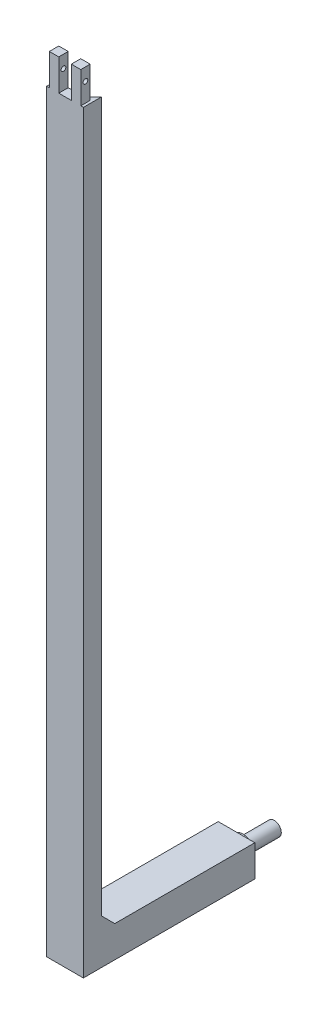
ISO-10303-21;
HEADER;
FILE_DESCRIPTION(('STEP AP214'),'2;1');
FILE_NAME('part.step','',(''),(''),'','','');
FILE_SCHEMA(('AUTOMOTIVE_DESIGN { 1 0 10303 214 1 1 1 1 }'));
ENDSEC;
DATA;
#1=APPLICATION_CONTEXT('core data for automotive mechanical design processes');
#2=APPLICATION_PROTOCOL_DEFINITION('international standard','automotive_design',2000,#1);
#3=PRODUCT_CONTEXT('',#1,'mechanical');
#4=PRODUCT('Part','Part','',(#3));
#5=PRODUCT_RELATED_PRODUCT_CATEGORY('part','',(#4));
#6=PRODUCT_DEFINITION_FORMATION('','',#4);
#7=PRODUCT_DEFINITION_CONTEXT('part definition',#1,'design');
#8=PRODUCT_DEFINITION('design','',#6,#7);
#9=PRODUCT_DEFINITION_SHAPE('','',#8);
#10=(LENGTH_UNIT() NAMED_UNIT(*) SI_UNIT(.MILLI.,.METRE.));
#11=(NAMED_UNIT(*) PLANE_ANGLE_UNIT() SI_UNIT($,.RADIAN.));
#12=(NAMED_UNIT(*) SI_UNIT($,.STERADIAN.) SOLID_ANGLE_UNIT());
#13=UNCERTAINTY_MEASURE_WITH_UNIT(LENGTH_MEASURE(1.E-05),#10,'distance_accuracy_value','');
#14=(GEOMETRIC_REPRESENTATION_CONTEXT(3) GLOBAL_UNCERTAINTY_ASSIGNED_CONTEXT((#13)) GLOBAL_UNIT_ASSIGNED_CONTEXT((#10,
#11,#12)) REPRESENTATION_CONTEXT('',''));
#15=CARTESIAN_POINT('',(0.,0.,0.));
#16=DIRECTION('',(0.,0.,1.));
#17=DIRECTION('',(1.,0.,0.));
#18=AXIS2_PLACEMENT_3D('',#15,#16,#17);
#19=CARTESIAN_POINT('',(0.,0.,0.));
#20=DIRECTION('',(0.,0.,-1.));
#21=DIRECTION('',(-1.,0.,0.));
#22=AXIS2_PLACEMENT_3D('',#19,#20,#21);
#23=PLANE('',#22);
#24=DIRECTION('',(-1.,0.,0.));
#25=VECTOR('',#24,1.);
#26=CARTESIAN_POINT('',(2.82842712474619,-223.,0.));
#27=LINE('',#26,#25);
#28=CARTESIAN_POINT('',(0.,-223.,0.));
#29=VERTEX_POINT('',#28);
#30=CARTESIAN_POINT('',(-5.99999999999997,-223.,0.));
#31=VERTEX_POINT('',#30);
#32=EDGE_CURVE('E64',#29,#31,#27,.T.);
#33=ORIENTED_EDGE('',*,*,#32,.T.);
#34=DIRECTION('',(0.,-1.,0.));
#35=VECTOR('',#34,1.);
#36=CARTESIAN_POINT('',(-6.,0.,0.));
#37=LINE('',#36,#35);
#38=CARTESIAN_POINT('',(-5.99999999999997,0.,0.));
#39=VERTEX_POINT('',#38);
#40=EDGE_CURVE('E339',#39,#31,#37,.T.);
#41=ORIENTED_EDGE('',*,*,#40,.F.);
#42=DIRECTION('',(-1.,0.,0.));
#43=VECTOR('',#42,1.);
#44=CARTESIAN_POINT('',(-7.99999999999998,0.,0.));
#45=LINE('',#44,#43);
#46=CARTESIAN_POINT('',(-7.99999999999998,0.,0.));
#47=VERTEX_POINT('',#46);
#48=EDGE_CURVE('E11',#39,#47,#45,.T.);
#49=ORIENTED_EDGE('',*,*,#48,.T.);
#50=DIRECTION('',(0.,-1.,0.));
#51=VECTOR('',#50,1.);
#52=CARTESIAN_POINT('',(-7.99999999999999,10.,0.));
#53=LINE('',#52,#51);
#54=CARTESIAN_POINT('',(-7.99999999999999,10.,0.));
#55=VERTEX_POINT('',#54);
#56=EDGE_CURVE('E266',#55,#47,#53,.T.);
#57=ORIENTED_EDGE('',*,*,#56,.F.);
#58=DIRECTION('',(-1.,0.,0.));
#59=VECTOR('',#58,1.);
#60=CARTESIAN_POINT('',(-7.99999999999999,10.,0.));
#61=LINE('',#60,#59);
#62=CARTESIAN_POINT('',(-4.99999999999999,10.,0.));
#63=VERTEX_POINT('',#62);
#64=EDGE_CURVE('E263',#63,#55,#61,.T.);
#65=ORIENTED_EDGE('',*,*,#64,.F.);
#66=DIRECTION('',(0.,-1.,0.));
#67=VECTOR('',#66,1.);
#68=CARTESIAN_POINT('',(-4.99999999999999,10.,0.));
#69=LINE('',#68,#67);
#70=CARTESIAN_POINT('',(-4.99999999999998,0.,0.));
#71=VERTEX_POINT('',#70);
#72=EDGE_CURVE('E276',#63,#71,#69,.T.);
#73=ORIENTED_EDGE('',*,*,#72,.T.);
#74=DIRECTION('',(-1.,0.,0.));
#75=VECTOR('',#74,1.);
#76=CARTESIAN_POINT('',(0.,0.,0.));
#77=LINE('',#76,#75);
#78=CARTESIAN_POINT('',(-0.999999999999984,0.,0.));
#79=VERTEX_POINT('',#78);
#80=EDGE_CURVE('E336',#79,#71,#77,.T.);
#81=ORIENTED_EDGE('',*,*,#80,.F.);
#82=DIRECTION('',(0.,-1.,0.));
#83=VECTOR('',#82,1.);
#84=CARTESIAN_POINT('',(-0.999999999999986,10.,0.));
#85=LINE('',#84,#83);
#86=CARTESIAN_POINT('',(-0.999999999999986,10.,0.));
#87=VERTEX_POINT('',#86);
#88=EDGE_CURVE('E243',#87,#79,#85,.T.);
#89=ORIENTED_EDGE('',*,*,#88,.F.);
#90=DIRECTION('',(-1.,0.,0.));
#91=VECTOR('',#90,1.);
#92=CARTESIAN_POINT('',(2.00000000000001,10.,0.));
#93=LINE('',#92,#91);
#94=CARTESIAN_POINT('',(2.00000000000001,10.,0.));
#95=VERTEX_POINT('',#94);
#96=EDGE_CURVE('E215',#95,#87,#93,.T.);
#97=ORIENTED_EDGE('',*,*,#96,.F.);
#98=DIRECTION('',(0.,-1.,0.));
#99=VECTOR('',#98,1.);
#100=CARTESIAN_POINT('',(2.00000000000001,10.,0.));
#101=LINE('',#100,#99);
#102=CARTESIAN_POINT('',(2.00000000000002,0.,0.));
#103=VERTEX_POINT('',#102);
#104=EDGE_CURVE('E247',#95,#103,#101,.T.);
#105=ORIENTED_EDGE('',*,*,#104,.T.);
#106=DIRECTION('',(-1.,0.,0.));
#107=VECTOR('',#106,1.);
#108=CARTESIAN_POINT('',(2.00000000000002,0.,0.));
#109=LINE('',#108,#107);
#110=CARTESIAN_POINT('',(0.,0.,0.));
#111=VERTEX_POINT('',#110);
#112=EDGE_CURVE('E229',#103,#111,#109,.T.);
#113=ORIENTED_EDGE('',*,*,#112,.T.);
#114=DIRECTION('',(0.,1.,0.));
#115=VECTOR('',#114,1.);
#116=CARTESIAN_POINT('',(0.,0.,0.));
#117=LINE('',#116,#115);
#118=EDGE_CURVE('E322',#29,#111,#117,.T.);
#119=ORIENTED_EDGE('',*,*,#118,.F.);
#120=EDGE_LOOP('',(#33,#41,#49,#57,#65,#73,#81,#89,#97,#105,#113,#119));
#121=FACE_BOUND('',#120,.T.);
#122=ADVANCED_FACE('F39',(#121),#23,.T.);
#123=CARTESIAN_POINT('',(0.,0.,0.));
#124=DIRECTION('',(-0.707106781186549,0.,-0.707106781186546));
#125=DIRECTION('',(-0.707106781186546,0.,0.707106781186549));
#126=AXIS2_PLACEMENT_3D('',#123,#124,#125);
#127=PLANE('',#126);
#128=DIRECTION('',(0.577350269189624,-0.577350269189627,-0.577350269189626));
#129=VECTOR('',#128,1.);
#130=CARTESIAN_POINT('',(-74.3333333333333,-148.666666666666,74.3333333333335));
#131=LINE('',#130,#129);
#132=CARTESIAN_POINT('',(2.82842712474619,-225.828427124746,-2.82842712474619));
#133=VERTEX_POINT('',#132);
#134=EDGE_CURVE('E57',#29,#133,#131,.T.);
#135=ORIENTED_EDGE('',*,*,#134,.F.);
#136=ORIENTED_EDGE('',*,*,#118,.T.);
#137=DIRECTION('',(0.707106781186546,0.,-0.707106781186549));
#138=VECTOR('',#137,1.);
#139=CARTESIAN_POINT('',(0.,0.,0.));
#140=LINE('',#139,#138);
#141=CARTESIAN_POINT('',(2.82842712474619,0.,-2.82842712474619));
#142=VERTEX_POINT('',#141);
#143=EDGE_CURVE('E307',#111,#142,#140,.T.);
#144=ORIENTED_EDGE('',*,*,#143,.T.);
#145=DIRECTION('',(0.,-1.,0.));
#146=VECTOR('',#145,1.);
#147=CARTESIAN_POINT('',(2.82842712474619,0.,-2.82842712474619));
#148=LINE('',#147,#146);
#149=EDGE_CURVE('E315',#142,#133,#148,.T.);
#150=ORIENTED_EDGE('',*,*,#149,.T.);
#151=EDGE_LOOP('',(#135,#136,#144,#150));
#152=FACE_BOUND('',#151,.T.);
#153=ADVANCED_FACE('F363',(#152),#127,.T.);
#154=CARTESIAN_POINT('',(-5.99999999999997,0.,0.));
#155=DIRECTION('',(0.707106781186549,0.,-0.707106781186546));
#156=DIRECTION('',(-0.707106781186546,0.,-0.707106781186549));
#157=AXIS2_PLACEMENT_3D('',#154,#155,#156);
#158=PLANE('',#157);
#159=DIRECTION('',(0.577350269189624,0.577350269189627,0.577350269189626));
#160=VECTOR('',#159,1.);
#161=CARTESIAN_POINT('',(68.3333333333333,-148.666666666666,74.3333333333335));
#162=LINE('',#161,#160);
#163=CARTESIAN_POINT('',(-8.82842712474615,-225.828427124746,-2.82842712474619));
#164=VERTEX_POINT('',#163);
#165=EDGE_CURVE('E392',#164,#31,#162,.T.);
#166=ORIENTED_EDGE('',*,*,#165,.F.);
#167=DIRECTION('',(0.,-1.,0.));
#168=VECTOR('',#167,1.);
#169=CARTESIAN_POINT('',(-8.82842712474615,0.,-2.8284271247462));
#170=LINE('',#169,#168);
#171=CARTESIAN_POINT('',(-8.82842712474615,0.,-2.8284271247462));
#172=VERTEX_POINT('',#171);
#173=EDGE_CURVE('E297',#172,#164,#170,.T.);
#174=ORIENTED_EDGE('',*,*,#173,.F.);
#175=DIRECTION('',(0.707106781186546,0.,0.707106781186549));
#176=VECTOR('',#175,1.);
#177=CARTESIAN_POINT('',(-5.99999999999997,0.,0.));
#178=LINE('',#177,#176);
#179=EDGE_CURVE('E293',#172,#39,#178,.T.);
#180=ORIENTED_EDGE('',*,*,#179,.T.);
#181=ORIENTED_EDGE('',*,*,#40,.T.);
#182=EDGE_LOOP('',(#166,#174,#180,#181));
#183=FACE_BOUND('',#182,.T.);
#184=ADVANCED_FACE('F369',(#183),#158,.T.);
#185=CARTESIAN_POINT('',(0.,0.,3.));
#186=DIRECTION('',(0.,-1.,0.));
#187=DIRECTION('',(1.,0.,0.));
#188=AXIS2_PLACEMENT_3D('',#185,#186,#187);
#189=PLANE('',#188);
#190=DIRECTION('',(0.,0.,-1.));
#191=VECTOR('',#190,1.);
#192=CARTESIAN_POINT('',(2.00000000000002,0.,3.));
#193=LINE('',#192,#191);
#194=CARTESIAN_POINT('',(2.00000000000002,0.,3.));
#195=VERTEX_POINT('',#194);
#196=EDGE_CURVE('E210',#195,#103,#193,.T.);
#197=ORIENTED_EDGE('',*,*,#196,.F.);
#198=DIRECTION('',(-1.,0.,0.));
#199=VECTOR('',#198,1.);
#200=CARTESIAN_POINT('',(0.,0.,3.));
#201=LINE('',#200,#199);
#202=CARTESIAN_POINT('',(2.82842712474618,0.,3.));
#203=VERTEX_POINT('',#202);
#204=EDGE_CURVE('E325',#203,#195,#201,.T.);
#205=ORIENTED_EDGE('',*,*,#204,.F.);
#206=DIRECTION('',(0.,0.,1.));
#207=VECTOR('',#206,1.);
#208=CARTESIAN_POINT('',(2.82842712474619,0.,-2.82842712474619));
#209=LINE('',#208,#207);
#210=EDGE_CURVE('E311',#142,#203,#209,.T.);
#211=ORIENTED_EDGE('',*,*,#210,.F.);
#212=ORIENTED_EDGE('',*,*,#143,.F.);
#213=ORIENTED_EDGE('',*,*,#112,.F.);
#214=EDGE_LOOP('',(#197,#205,#211,#212,#213));
#215=FACE_BOUND('',#214,.T.);
#216=ADVANCED_FACE('F386',(#215),#189,.F.);
#217=DIRECTION('',(0.,0.,1.));
#218=VECTOR('',#217,1.);
#219=CARTESIAN_POINT('',(-0.999999999999984,0.,3.));
#220=LINE('',#219,#218);
#221=CARTESIAN_POINT('',(-0.999999999999984,0.,3.));
#222=VERTEX_POINT('',#221);
#223=EDGE_CURVE('E216',#79,#222,#220,.T.);
#224=ORIENTED_EDGE('',*,*,#223,.F.);
#225=ORIENTED_EDGE('',*,*,#80,.T.);
#226=DIRECTION('',(0.,0.,-1.));
#227=VECTOR('',#226,1.);
#228=CARTESIAN_POINT('',(-4.99999999999998,0.,3.));
#229=LINE('',#228,#227);
#230=CARTESIAN_POINT('',(-4.99999999999998,0.,3.));
#231=VERTEX_POINT('',#230);
#232=EDGE_CURVE('E257',#231,#71,#229,.T.);
#233=ORIENTED_EDGE('',*,*,#232,.F.);
#234=EDGE_CURVE('E329',#222,#231,#201,.T.);
#235=ORIENTED_EDGE('',*,*,#234,.F.);
#236=EDGE_LOOP('',(#224,#225,#233,#235));
#237=FACE_BOUND('',#236,.T.);
#238=ADVANCED_FACE('F384',(#237),#189,.F.);
#239=DIRECTION('',(0.,0.,1.));
#240=VECTOR('',#239,1.);
#241=CARTESIAN_POINT('',(-7.99999999999999,0.,3.));
#242=LINE('',#241,#240);
#243=CARTESIAN_POINT('',(-7.99999999999999,0.,3.));
#244=VERTEX_POINT('',#243);
#245=EDGE_CURVE('E251',#47,#244,#242,.T.);
#246=ORIENTED_EDGE('',*,*,#245,.F.);
#247=ORIENTED_EDGE('',*,*,#48,.F.);
#248=ORIENTED_EDGE('',*,*,#179,.F.);
#249=DIRECTION('',(0.,0.,-1.));
#250=VECTOR('',#249,1.);
#251=CARTESIAN_POINT('',(-8.82842712474615,0.,-2.8284271247462));
#252=LINE('',#251,#250);
#253=CARTESIAN_POINT('',(-8.82842712474615,0.,3.));
#254=VERTEX_POINT('',#253);
#255=EDGE_CURVE('E289',#254,#172,#252,.T.);
#256=ORIENTED_EDGE('',*,*,#255,.F.);
#257=EDGE_CURVE('E330',#244,#254,#201,.T.);
#258=ORIENTED_EDGE('',*,*,#257,.F.);
#259=EDGE_LOOP('',(#246,#247,#248,#256,#258));
#260=FACE_BOUND('',#259,.T.);
#261=ADVANCED_FACE('F41',(#260),#189,.F.);
#262=CARTESIAN_POINT('',(0.,-240.,3.));
#263=DIRECTION('',(0.,1.,0.));
#264=DIRECTION('',(0.,0.,1.));
#265=AXIS2_PLACEMENT_3D('',#262,#263,#264);
#266=PLANE('',#265);
#267=DIRECTION('',(0.,0.,-1.));
#268=VECTOR('',#267,1.);
#269=CARTESIAN_POINT('',(-8.82842712474615,-240.,-2.8284271247462));
#270=LINE('',#269,#268);
#271=CARTESIAN_POINT('',(-8.82842712474615,-240.,3.));
#272=VERTEX_POINT('',#271);
#273=CARTESIAN_POINT('',(-8.82842712474615,-240.,-51.58));
#274=VERTEX_POINT('',#273);
#275=EDGE_CURVE('E288',#272,#274,#270,.T.);
#276=ORIENTED_EDGE('',*,*,#275,.T.);
#277=DIRECTION('',(-1.,0.,0.));
#278=VECTOR('',#277,1.);
#279=CARTESIAN_POINT('',(-8.82842712474615,-240.,-51.58));
#280=LINE('',#279,#278);
#281=CARTESIAN_POINT('',(2.82842712474619,-240.,-51.58));
#282=VERTEX_POINT('',#281);
#283=EDGE_CURVE('E180',#282,#274,#280,.T.);
#284=ORIENTED_EDGE('',*,*,#283,.F.);
#285=DIRECTION('',(0.,0.,1.));
#286=VECTOR('',#285,1.);
#287=CARTESIAN_POINT('',(2.82842712474619,-240.,-2.82842712474619));
#288=LINE('',#287,#286);
#289=CARTESIAN_POINT('',(2.82842712474618,-240.,3.));
#290=VERTEX_POINT('',#289);
#291=EDGE_CURVE('E304',#282,#290,#288,.T.);
#292=ORIENTED_EDGE('',*,*,#291,.T.);
#293=DIRECTION('',(1.,0.,0.));
#294=VECTOR('',#293,1.);
#295=CARTESIAN_POINT('',(0.,-240.,3.));
#296=LINE('',#295,#294);
#297=EDGE_CURVE('E49',#272,#290,#296,.T.);
#298=ORIENTED_EDGE('',*,*,#297,.F.);
#299=EDGE_LOOP('',(#276,#284,#292,#298));
#300=FACE_BOUND('',#299,.T.);
#301=ADVANCED_FACE('F373',(#300),#266,.F.);
#302=CARTESIAN_POINT('',(0.,0.,3.));
#303=DIRECTION('',(0.,0.,-1.));
#304=DIRECTION('',(-1.,0.,0.));
#305=AXIS2_PLACEMENT_3D('',#302,#303,#304);
#306=PLANE('',#305);
#307=ORIENTED_EDGE('',*,*,#297,.T.);
#308=DIRECTION('',(0.,-1.,0.));
#309=VECTOR('',#308,1.);
#310=CARTESIAN_POINT('',(2.82842712474618,0.,3.));
#311=LINE('',#310,#309);
#312=EDGE_CURVE('E318',#203,#290,#311,.T.);
#313=ORIENTED_EDGE('',*,*,#312,.F.);
#314=ORIENTED_EDGE('',*,*,#204,.T.);
#315=DIRECTION('',(0.,-1.,0.));
#316=VECTOR('',#315,1.);
#317=CARTESIAN_POINT('',(2.00000000000002,10.,3.));
#318=LINE('',#317,#316);
#319=CARTESIAN_POINT('',(2.00000000000002,10.,3.));
#320=VERTEX_POINT('',#319);
#321=EDGE_CURVE('E225',#320,#195,#318,.T.);
#322=ORIENTED_EDGE('',*,*,#321,.F.);
#323=DIRECTION('',(1.,0.,0.));
#324=VECTOR('',#323,1.);
#325=CARTESIAN_POINT('',(2.00000000000002,10.,3.));
#326=LINE('',#325,#324);
#327=CARTESIAN_POINT('',(-0.999999999999986,10.,3.));
#328=VERTEX_POINT('',#327);
#329=EDGE_CURVE('E222',#328,#320,#326,.T.);
#330=ORIENTED_EDGE('',*,*,#329,.F.);
#331=DIRECTION('',(0.,-1.,0.));
#332=VECTOR('',#331,1.);
#333=CARTESIAN_POINT('',(-0.999999999999986,10.,3.));
#334=LINE('',#333,#332);
#335=EDGE_CURVE('E239',#328,#222,#334,.T.);
#336=ORIENTED_EDGE('',*,*,#335,.T.);
#337=ORIENTED_EDGE('',*,*,#234,.T.);
#338=DIRECTION('',(0.,-1.,0.));
#339=VECTOR('',#338,1.);
#340=CARTESIAN_POINT('',(-4.99999999999999,10.,3.));
#341=LINE('',#340,#339);
#342=CARTESIAN_POINT('',(-4.99999999999999,10.,3.));
#343=VERTEX_POINT('',#342);
#344=EDGE_CURVE('E280',#343,#231,#341,.T.);
#345=ORIENTED_EDGE('',*,*,#344,.F.);
#346=DIRECTION('',(1.,0.,0.));
#347=VECTOR('',#346,1.);
#348=CARTESIAN_POINT('',(-7.99999999999999,10.,3.));
#349=LINE('',#348,#347);
#350=CARTESIAN_POINT('',(-7.99999999999999,10.,3.));
#351=VERTEX_POINT('',#350);
#352=EDGE_CURVE('E256',#351,#343,#349,.T.);
#353=ORIENTED_EDGE('',*,*,#352,.F.);
#354=DIRECTION('',(0.,-1.,0.));
#355=VECTOR('',#354,1.);
#356=CARTESIAN_POINT('',(-7.99999999999999,10.,3.));
#357=LINE('',#356,#355);
#358=EDGE_CURVE('E284',#351,#244,#357,.T.);
#359=ORIENTED_EDGE('',*,*,#358,.T.);
#360=ORIENTED_EDGE('',*,*,#257,.T.);
#361=DIRECTION('',(0.,-1.,0.));
#362=VECTOR('',#361,1.);
#363=CARTESIAN_POINT('',(-8.82842712474615,0.,3.));
#364=LINE('',#363,#362);
#365=EDGE_CURVE('E300',#254,#272,#364,.T.);
#366=ORIENTED_EDGE('',*,*,#365,.T.);
#367=EDGE_LOOP('',(#307,#313,#314,#322,#330,#336,#337,#345,#353,#359,#360,#366));
#368=FACE_BOUND('',#367,.T.);
#369=ADVANCED_FACE('F372',(#368),#306,.F.);
#370=CARTESIAN_POINT('',(2.82842712474619,0.,-2.82842712474619));
#371=DIRECTION('',(1.,0.,0.));
#372=DIRECTION('',(0.,0.,-1.));
#373=AXIS2_PLACEMENT_3D('',#370,#371,#372);
#374=PLANE('',#373);
#375=DIRECTION('',(0.,-0.707106781186548,-0.707106781186547));
#376=VECTOR('',#375,1.);
#377=CARTESIAN_POINT('',(2.82842712474619,-223.,0.));
#378=LINE('',#377,#376);
#379=CARTESIAN_POINT('',(2.82842712474619,-230.,-7.));
#380=VERTEX_POINT('',#379);
#381=EDGE_CURVE('E398',#133,#380,#378,.T.);
#382=ORIENTED_EDGE('',*,*,#381,.F.);
#383=ORIENTED_EDGE('',*,*,#149,.F.);
#384=ORIENTED_EDGE('',*,*,#210,.T.);
#385=ORIENTED_EDGE('',*,*,#312,.T.);
#386=ORIENTED_EDGE('',*,*,#291,.F.);
#387=DIRECTION('',(0.,-1.,0.));
#388=VECTOR('',#387,1.);
#389=CARTESIAN_POINT('',(2.82842712474619,-240.,-51.58));
#390=LINE('',#389,#388);
#391=CARTESIAN_POINT('',(2.82842712474619,-230.,-51.58));
#392=VERTEX_POINT('',#391);
#393=EDGE_CURVE('E173',#392,#282,#390,.T.);
#394=ORIENTED_EDGE('',*,*,#393,.F.);
#395=DIRECTION('',(0.,0.,1.));
#396=VECTOR('',#395,1.);
#397=CARTESIAN_POINT('',(2.82842712474619,-230.,-51.58));
#398=LINE('',#397,#396);
#399=EDGE_CURVE('E168',#392,#380,#398,.T.);
#400=ORIENTED_EDGE('',*,*,#399,.T.);
#401=EDGE_LOOP('',(#382,#383,#384,#385,#386,#394,#400));
#402=FACE_BOUND('',#401,.T.);
#403=ADVANCED_FACE('F381',(#402),#374,.T.);
#404=CARTESIAN_POINT('',(-8.82842712474615,0.,-2.8284271247462));
#405=DIRECTION('',(-1.,0.,0.));
#406=DIRECTION('',(0.,0.,1.));
#407=AXIS2_PLACEMENT_3D('',#404,#405,#406);
#408=PLANE('',#407);
#409=ORIENTED_EDGE('',*,*,#173,.T.);
#410=DIRECTION('',(0.,-0.707106781186548,-0.707106781186547));
#411=VECTOR('',#410,1.);
#412=CARTESIAN_POINT('',(-8.82842712474615,-223.,0.));
#413=LINE('',#412,#411);
#414=CARTESIAN_POINT('',(-8.82842712474615,-230.,-7.));
#415=VERTEX_POINT('',#414);
#416=EDGE_CURVE('E189',#164,#415,#413,.T.);
#417=ORIENTED_EDGE('',*,*,#416,.T.);
#418=DIRECTION('',(0.,0.,1.));
#419=VECTOR('',#418,1.);
#420=CARTESIAN_POINT('',(-8.82842712474615,-230.,-51.58));
#421=LINE('',#420,#419);
#422=CARTESIAN_POINT('',(-8.82842712474615,-230.,-51.58));
#423=VERTEX_POINT('',#422);
#424=EDGE_CURVE('E165',#423,#415,#421,.T.);
#425=ORIENTED_EDGE('',*,*,#424,.F.);
#426=DIRECTION('',(0.,1.,0.));
#427=VECTOR('',#426,1.);
#428=CARTESIAN_POINT('',(-8.82842712474615,-240.,-51.58));
#429=LINE('',#428,#427);
#430=EDGE_CURVE('E174',#274,#423,#429,.T.);
#431=ORIENTED_EDGE('',*,*,#430,.F.);
#432=ORIENTED_EDGE('',*,*,#275,.F.);
#433=ORIENTED_EDGE('',*,*,#365,.F.);
#434=ORIENTED_EDGE('',*,*,#255,.T.);
#435=EDGE_LOOP('',(#409,#417,#425,#431,#432,#433,#434));
#436=FACE_BOUND('',#435,.T.);
#437=ADVANCED_FACE('F187',(#436),#408,.T.);
#438=CARTESIAN_POINT('',(-7.99999999999999,10.,3.));
#439=DIRECTION('',(1.,0.,0.));
#440=DIRECTION('',(0.,0.,-1.));
#441=AXIS2_PLACEMENT_3D('',#438,#439,#440);
#442=PLANE('',#441);
#443=CARTESIAN_POINT('',(-7.99999999999999,6.,1.50000000000001));
#444=DIRECTION('',(1.,0.,0.));
#445=DIRECTION('',(0.,0.,-1.));
#446=AXIS2_PLACEMENT_3D('',#443,#444,#445);
#447=CIRCLE('',#446,0.75);
#448=CARTESIAN_POINT('',(-7.99999999999999,6.,0.750000000000006));
#449=VERTEX_POINT('',#448);
#450=EDGE_CURVE('E206',#449,#449,#447,.T.);
#451=ORIENTED_EDGE('',*,*,#450,.T.);
#452=EDGE_LOOP('',(#451));
#453=FACE_BOUND('',#452,.T.);
#454=ORIENTED_EDGE('',*,*,#245,.T.);
#455=ORIENTED_EDGE('',*,*,#358,.F.);
#456=DIRECTION('',(0.,0.,1.));
#457=VECTOR('',#456,1.);
#458=CARTESIAN_POINT('',(-7.99999999999999,10.,3.));
#459=LINE('',#458,#457);
#460=EDGE_CURVE('E252',#55,#351,#459,.T.);
#461=ORIENTED_EDGE('',*,*,#460,.F.);
#462=ORIENTED_EDGE('',*,*,#56,.T.);
#463=EDGE_LOOP('',(#454,#455,#461,#462));
#464=FACE_BOUND('',#463,.T.);
#465=ADVANCED_FACE('F444',(#453,#464),#442,.F.);
#466=CARTESIAN_POINT('',(-4.99999999999999,10.,3.));
#467=DIRECTION('',(-1.,0.,0.));
#468=DIRECTION('',(0.,-1.,0.));
#469=AXIS2_PLACEMENT_3D('',#466,#467,#468);
#470=PLANE('',#469);
#471=CARTESIAN_POINT('',(-4.99999999999998,6.,1.5));
#472=DIRECTION('',(-1.,0.,0.));
#473=DIRECTION('',(0.,-1.,0.));
#474=AXIS2_PLACEMENT_3D('',#471,#472,#473);
#475=CIRCLE('',#474,0.75);
#476=CARTESIAN_POINT('',(-4.99999999999998,5.25,1.5));
#477=VERTEX_POINT('',#476);
#478=EDGE_CURVE('E202',#477,#477,#475,.T.);
#479=ORIENTED_EDGE('',*,*,#478,.T.);
#480=EDGE_LOOP('',(#479));
#481=FACE_BOUND('',#480,.T.);
#482=ORIENTED_EDGE('',*,*,#232,.T.);
#483=ORIENTED_EDGE('',*,*,#72,.F.);
#484=DIRECTION('',(0.,0.,-1.));
#485=VECTOR('',#484,1.);
#486=CARTESIAN_POINT('',(-4.99999999999999,10.,3.));
#487=LINE('',#486,#485);
#488=EDGE_CURVE('E260',#343,#63,#487,.T.);
#489=ORIENTED_EDGE('',*,*,#488,.F.);
#490=ORIENTED_EDGE('',*,*,#344,.T.);
#491=EDGE_LOOP('',(#482,#483,#489,#490));
#492=FACE_BOUND('',#491,.T.);
#493=ADVANCED_FACE('F452',(#481,#492),#470,.F.);
#494=CARTESIAN_POINT('',(0.,10.,0.));
#495=DIRECTION('',(0.,-1.,0.));
#496=DIRECTION('',(1.,0.,0.));
#497=AXIS2_PLACEMENT_3D('',#494,#495,#496);
#498=PLANE('',#497);
#499=ORIENTED_EDGE('',*,*,#460,.T.);
#500=ORIENTED_EDGE('',*,*,#352,.T.);
#501=ORIENTED_EDGE('',*,*,#488,.T.);
#502=ORIENTED_EDGE('',*,*,#64,.T.);
#503=EDGE_LOOP('',(#499,#500,#501,#502));
#504=FACE_BOUND('',#503,.T.);
#505=ADVANCED_FACE('F448',(#504),#498,.F.);
#506=CARTESIAN_POINT('',(2.00000000000002,10.,3.));
#507=DIRECTION('',(-1.,0.,0.));
#508=DIRECTION('',(0.,0.,1.));
#509=AXIS2_PLACEMENT_3D('',#506,#507,#508);
#510=PLANE('',#509);
#511=CARTESIAN_POINT('',(2.00000000000002,6.,1.5));
#512=DIRECTION('',(1.,0.,0.));
#513=DIRECTION('',(0.,0.,-1.));
#514=AXIS2_PLACEMENT_3D('',#511,#512,#513);
#515=CIRCLE('',#514,0.75);
#516=CARTESIAN_POINT('',(2.00000000000002,6.,0.75));
#517=VERTEX_POINT('',#516);
#518=EDGE_CURVE('E192',#517,#517,#515,.T.);
#519=ORIENTED_EDGE('',*,*,#518,.F.);
#520=EDGE_LOOP('',(#519));
#521=FACE_BOUND('',#520,.T.);
#522=ORIENTED_EDGE('',*,*,#196,.T.);
#523=ORIENTED_EDGE('',*,*,#104,.F.);
#524=DIRECTION('',(0.,0.,-1.));
#525=VECTOR('',#524,1.);
#526=CARTESIAN_POINT('',(2.00000000000002,10.,3.));
#527=LINE('',#526,#525);
#528=EDGE_CURVE('E211',#320,#95,#527,.T.);
#529=ORIENTED_EDGE('',*,*,#528,.F.);
#530=ORIENTED_EDGE('',*,*,#321,.T.);
#531=EDGE_LOOP('',(#522,#523,#529,#530));
#532=FACE_BOUND('',#531,.T.);
#533=ADVANCED_FACE('F429',(#521,#532),#510,.F.);
#534=CARTESIAN_POINT('',(-0.999999999999986,10.,3.));
#535=DIRECTION('',(1.,0.,0.));
#536=DIRECTION('',(0.,1.,0.));
#537=AXIS2_PLACEMENT_3D('',#534,#535,#536);
#538=PLANE('',#537);
#539=CARTESIAN_POINT('',(-0.999999999999987,6.,1.5));
#540=DIRECTION('',(1.,0.,0.));
#541=DIRECTION('',(0.,1.,0.));
#542=AXIS2_PLACEMENT_3D('',#539,#540,#541);
#543=CIRCLE('',#542,0.75);
#544=CARTESIAN_POINT('',(-0.999999999999987,6.75,1.5));
#545=VERTEX_POINT('',#544);
#546=EDGE_CURVE('E197',#545,#545,#543,.T.);
#547=ORIENTED_EDGE('',*,*,#546,.T.);
#548=EDGE_LOOP('',(#547));
#549=FACE_BOUND('',#548,.T.);
#550=ORIENTED_EDGE('',*,*,#223,.T.);
#551=ORIENTED_EDGE('',*,*,#335,.F.);
#552=DIRECTION('',(0.,0.,1.));
#553=VECTOR('',#552,1.);
#554=CARTESIAN_POINT('',(-0.999999999999986,10.,3.));
#555=LINE('',#554,#553);
#556=EDGE_CURVE('E219',#87,#328,#555,.T.);
#557=ORIENTED_EDGE('',*,*,#556,.F.);
#558=ORIENTED_EDGE('',*,*,#88,.T.);
#559=EDGE_LOOP('',(#550,#551,#557,#558));
#560=FACE_BOUND('',#559,.T.);
#561=ADVANCED_FACE('F345',(#549,#560),#538,.F.);
#562=CARTESIAN_POINT('',(0.,10.,0.));
#563=DIRECTION('',(0.,1.,0.));
#564=DIRECTION('',(-1.,0.,0.));
#565=AXIS2_PLACEMENT_3D('',#562,#563,#564);
#566=PLANE('',#565);
#567=ORIENTED_EDGE('',*,*,#528,.T.);
#568=ORIENTED_EDGE('',*,*,#96,.T.);
#569=ORIENTED_EDGE('',*,*,#556,.T.);
#570=ORIENTED_EDGE('',*,*,#329,.T.);
#571=EDGE_LOOP('',(#567,#568,#569,#570));
#572=FACE_BOUND('',#571,.T.);
#573=ADVANCED_FACE('F351',(#572),#566,.T.);
#574=CARTESIAN_POINT('',(-38.,5.99999999999999,1.50000000000002));
#575=DIRECTION('',(1.,0.,0.));
#576=DIRECTION('',(0.,0.,-1.));
#577=AXIS2_PLACEMENT_3D('',#574,#575,#576);
#578=CYLINDRICAL_SURFACE('',#577,0.75);
#579=ORIENTED_EDGE('',*,*,#518,.T.);
#580=EDGE_LOOP('',(#579));
#581=FACE_BOUND('',#580,.T.);
#582=ORIENTED_EDGE('',*,*,#546,.F.);
#583=EDGE_LOOP('',(#582));
#584=FACE_BOUND('',#583,.T.);
#585=ADVANCED_FACE('F348',(#581,#584),#578,.F.);
#586=ORIENTED_EDGE('',*,*,#478,.F.);
#587=EDGE_LOOP('',(#586));
#588=FACE_BOUND('',#587,.T.);
#589=ORIENTED_EDGE('',*,*,#450,.F.);
#590=EDGE_LOOP('',(#589));
#591=FACE_BOUND('',#590,.T.);
#592=ADVANCED_FACE('F350',(#588,#591),#578,.F.);
#593=CARTESIAN_POINT('',(-8.82842712474615,-230.,-51.58));
#594=DIRECTION('',(0.,-1.,0.));
#595=DIRECTION('',(0.,0.,-1.));
#596=AXIS2_PLACEMENT_3D('',#593,#594,#595);
#597=PLANE('',#596);
#598=ORIENTED_EDGE('',*,*,#424,.T.);
#599=DIRECTION('',(-1.,0.,0.));
#600=VECTOR('',#599,1.);
#601=CARTESIAN_POINT('',(2.82842712474619,-230.,-7.));
#602=LINE('',#601,#600);
#603=EDGE_CURVE('E396',#380,#415,#602,.T.);
#604=ORIENTED_EDGE('',*,*,#603,.F.);
#605=ORIENTED_EDGE('',*,*,#399,.F.);
#606=DIRECTION('',(1.,0.,0.));
#607=VECTOR('',#606,1.);
#608=CARTESIAN_POINT('',(-8.82842712474615,-230.,-51.58));
#609=LINE('',#608,#607);
#610=EDGE_CURVE('E161',#423,#392,#609,.T.);
#611=ORIENTED_EDGE('',*,*,#610,.F.);
#612=EDGE_LOOP('',(#598,#604,#605,#611));
#613=FACE_BOUND('',#612,.T.);
#614=ADVANCED_FACE('F163',(#613),#597,.F.);
#615=CARTESIAN_POINT('',(0.,0.,-51.58));
#616=DIRECTION('',(0.,0.,-1.));
#617=DIRECTION('',(-1.,0.,0.));
#618=AXIS2_PLACEMENT_3D('',#615,#616,#617);
#619=PLANE('',#618);
#620=CARTESIAN_POINT('',(-2.99999999999999,-235.,-51.58));
#621=DIRECTION('',(0.,0.,-1.));
#622=DIRECTION('',(-1.,0.,0.));
#623=AXIS2_PLACEMENT_3D('',#620,#621,#622);
#624=CIRCLE('',#623,3.5);
#625=CARTESIAN_POINT('',(-6.49999999999999,-235.,-51.58));
#626=VERTEX_POINT('',#625);
#627=EDGE_CURVE('E702',#626,#626,#624,.T.);
#628=ORIENTED_EDGE('',*,*,#627,.F.);
#629=EDGE_LOOP('',(#628));
#630=FACE_BOUND('',#629,.T.);
#631=ORIENTED_EDGE('',*,*,#430,.T.);
#632=ORIENTED_EDGE('',*,*,#610,.T.);
#633=ORIENTED_EDGE('',*,*,#393,.T.);
#634=ORIENTED_EDGE('',*,*,#283,.T.);
#635=EDGE_LOOP('',(#631,#632,#633,#634));
#636=FACE_BOUND('',#635,.T.);
#637=ADVANCED_FACE('F178',(#630,#636),#619,.T.);
#638=CARTESIAN_POINT('',(2.82842712474619,-223.,0.));
#639=DIRECTION('',(0.,0.707106781186547,-0.707106781186548));
#640=DIRECTION('',(0.,0.707106781186548,0.707106781186547));
#641=AXIS2_PLACEMENT_3D('',#638,#639,#640);
#642=PLANE('',#641);
#643=ORIENTED_EDGE('',*,*,#32,.F.);
#644=ORIENTED_EDGE('',*,*,#134,.T.);
#645=ORIENTED_EDGE('',*,*,#381,.T.);
#646=ORIENTED_EDGE('',*,*,#603,.T.);
#647=ORIENTED_EDGE('',*,*,#416,.F.);
#648=ORIENTED_EDGE('',*,*,#165,.T.);
#649=EDGE_LOOP('',(#643,#644,#645,#646,#647,#648));
#650=FACE_BOUND('',#649,.T.);
#651=ADVANCED_FACE('F394',(#650),#642,.T.);
#652=CARTESIAN_POINT('',(-2.99999999999999,-235.,-53.58));
#653=DIRECTION('',(0.,0.,1.));
#654=DIRECTION('',(1.,0.,0.));
#655=AXIS2_PLACEMENT_3D('',#652,#653,#654);
#656=CYLINDRICAL_SURFACE('',#655,3.5);
#657=CARTESIAN_POINT('',(-2.99999999999999,-235.,-53.58));
#658=DIRECTION('',(0.,0.,-1.));
#659=DIRECTION('',(-1.,0.,0.));
#660=AXIS2_PLACEMENT_3D('',#657,#658,#659);
#661=CIRCLE('',#660,3.5);
#662=CARTESIAN_POINT('',(-6.49999999999999,-235.,-53.58));
#663=VERTEX_POINT('',#662);
#664=EDGE_CURVE('E404',#663,#663,#661,.T.);
#665=ORIENTED_EDGE('',*,*,#664,.F.);
#666=EDGE_LOOP('',(#665));
#667=FACE_BOUND('',#666,.T.);
#668=ORIENTED_EDGE('',*,*,#627,.T.);
#669=EDGE_LOOP('',(#668));
#670=FACE_BOUND('',#669,.T.);
#671=ADVANCED_FACE('F494',(#667,#670),#656,.T.);
#672=CARTESIAN_POINT('',(-2.99999999999999,-235.,-53.58));
#673=DIRECTION('',(0.,0.,-1.));
#674=DIRECTION('',(-1.,0.,0.));
#675=AXIS2_PLACEMENT_3D('',#672,#673,#674);
#676=PLANE('',#675);
#677=CARTESIAN_POINT('',(-2.99999999999999,-235.,-53.58));
#678=DIRECTION('',(0.,0.,-1.));
#679=DIRECTION('',(-1.,0.,0.));
#680=AXIS2_PLACEMENT_3D('',#677,#678,#679);
#681=CIRCLE('',#680,2.25);
#682=CARTESIAN_POINT('',(-5.24999999999999,-235.,-53.58));
#683=VERTEX_POINT('',#682);
#684=EDGE_CURVE('E43',#683,#683,#681,.T.);
#685=ORIENTED_EDGE('',*,*,#684,.F.);
#686=EDGE_LOOP('',(#685));
#687=FACE_BOUND('',#686,.T.);
#688=ORIENTED_EDGE('',*,*,#664,.T.);
#689=EDGE_LOOP('',(#688));
#690=FACE_BOUND('',#689,.T.);
#691=ADVANCED_FACE('F500',(#687,#690),#676,.T.);
#692=CARTESIAN_POINT('',(-2.99999999999999,-235.,-63.58));
#693=DIRECTION('',(0.,0.,-1.));
#694=DIRECTION('',(-1.,0.,0.));
#695=AXIS2_PLACEMENT_3D('',#692,#693,#694);
#696=PLANE('',#695);
#697=CARTESIAN_POINT('',(-2.99999999999999,-235.,-63.58));
#698=DIRECTION('',(0.,0.,-1.));
#699=DIRECTION('',(-1.,0.,0.));
#700=AXIS2_PLACEMENT_3D('',#697,#698,#699);
#701=CIRCLE('',#700,2.25);
#702=CARTESIAN_POINT('',(-5.24999999999999,-235.,-63.58));
#703=VERTEX_POINT('',#702);
#704=EDGE_CURVE('E184',#703,#703,#701,.T.);
#705=ORIENTED_EDGE('',*,*,#704,.T.);
#706=EDGE_LOOP('',(#705));
#707=FACE_BOUND('',#706,.T.);
#708=ADVANCED_FACE('F508',(#707),#696,.T.);
#709=CARTESIAN_POINT('',(-2.99999999999999,-235.,-63.58));
#710=DIRECTION('',(0.,0.,1.));
#711=DIRECTION('',(1.,0.,0.));
#712=AXIS2_PLACEMENT_3D('',#709,#710,#711);
#713=CYLINDRICAL_SURFACE('',#712,2.25);
#714=ORIENTED_EDGE('',*,*,#684,.T.);
#715=EDGE_LOOP('',(#714));
#716=FACE_BOUND('',#715,.T.);
#717=ORIENTED_EDGE('',*,*,#704,.F.);
#718=EDGE_LOOP('',(#717));
#719=FACE_BOUND('',#718,.T.);
#720=ADVANCED_FACE('F516',(#716,#719),#713,.T.);
#721=CLOSED_SHELL('',(#122,#153,#184,#216,#238,#261,#301,#369,#403,#437,#465,#493,#505,#533,
#561,#573,#585,#592,#614,#637,#651,#671,#691,#708,#720));
#722=MANIFOLD_SOLID_BREP('B2',#721);
#723=ADVANCED_BREP_SHAPE_REPRESENTATION('',(#18,#722),#14);
#724=SHAPE_DEFINITION_REPRESENTATION(#9,#723);
ENDSEC;
END-ISO-10303-21;
